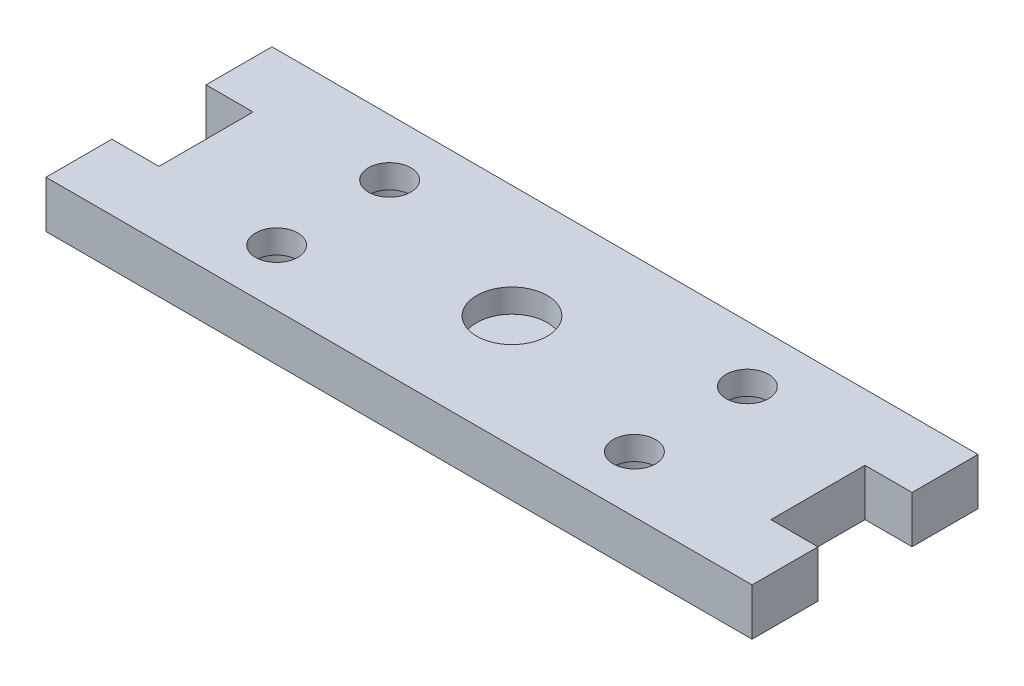
ISO-10303-21;
HEADER;
FILE_DESCRIPTION(('STEP AP214'),'2;1');
FILE_NAME('part.step','',(''),(''),'','','');
FILE_SCHEMA(('AUTOMOTIVE_DESIGN { 1 0 10303 214 1 1 1 1 }'));
ENDSEC;
DATA;
#1=APPLICATION_CONTEXT('core data for automotive mechanical design processes');
#2=APPLICATION_PROTOCOL_DEFINITION('international standard','automotive_design',2000,#1);
#3=PRODUCT_CONTEXT('',#1,'mechanical');
#4=PRODUCT('Part','Part','',(#3));
#5=PRODUCT_RELATED_PRODUCT_CATEGORY('part','',(#4));
#6=PRODUCT_DEFINITION_FORMATION('','',#4);
#7=PRODUCT_DEFINITION_CONTEXT('part definition',#1,'design');
#8=PRODUCT_DEFINITION('design','',#6,#7);
#9=PRODUCT_DEFINITION_SHAPE('','',#8);
#10=(LENGTH_UNIT() NAMED_UNIT(*) SI_UNIT(.MILLI.,.METRE.));
#11=(NAMED_UNIT(*) PLANE_ANGLE_UNIT() SI_UNIT($,.RADIAN.));
#12=(NAMED_UNIT(*) SI_UNIT($,.STERADIAN.) SOLID_ANGLE_UNIT());
#13=UNCERTAINTY_MEASURE_WITH_UNIT(LENGTH_MEASURE(1.E-05),#10,'distance_accuracy_value','');
#14=(GEOMETRIC_REPRESENTATION_CONTEXT(3) GLOBAL_UNCERTAINTY_ASSIGNED_CONTEXT((#13)) GLOBAL_UNIT_ASSIGNED_CONTEXT((#10,
#11,#12)) REPRESENTATION_CONTEXT('',''));
#15=CARTESIAN_POINT('',(0.,0.,0.));
#16=DIRECTION('',(0.,0.,1.));
#17=DIRECTION('',(1.,0.,0.));
#18=AXIS2_PLACEMENT_3D('',#15,#16,#17);
#19=CARTESIAN_POINT('',(75.,10.,-24.));
#20=DIRECTION('',(-1.,0.,0.));
#21=DIRECTION('',(0.,0.,1.));
#22=AXIS2_PLACEMENT_3D('',#19,#20,#21);
#23=PLANE('',#22);
#24=DIRECTION('',(0.,0.,-1.));
#25=VECTOR('',#24,1.);
#26=CARTESIAN_POINT('',(75.,0.,-24.));
#27=LINE('',#26,#25);
#28=CARTESIAN_POINT('',(75.,0.,24.));
#29=VERTEX_POINT('',#28);
#30=CARTESIAN_POINT('',(75.,0.,10.));
#31=VERTEX_POINT('',#30);
#32=EDGE_CURVE('E255',#29,#31,#27,.T.);
#33=ORIENTED_EDGE('',*,*,#32,.T.);
#34=DIRECTION('',(0.,1.,0.));
#35=VECTOR('',#34,1.);
#36=CARTESIAN_POINT('',(75.,10.,10.));
#37=LINE('',#36,#35);
#38=CARTESIAN_POINT('',(75.,10.,10.));
#39=VERTEX_POINT('',#38);
#40=EDGE_CURVE('E135',#31,#39,#37,.T.);
#41=ORIENTED_EDGE('',*,*,#40,.T.);
#42=DIRECTION('',(0.,0.,-1.));
#43=VECTOR('',#42,1.);
#44=CARTESIAN_POINT('',(75.,10.,-24.));
#45=LINE('',#44,#43);
#46=CARTESIAN_POINT('',(75.,10.,24.));
#47=VERTEX_POINT('',#46);
#48=EDGE_CURVE('E242',#47,#39,#45,.T.);
#49=ORIENTED_EDGE('',*,*,#48,.F.);
#50=DIRECTION('',(0.,-1.,0.));
#51=VECTOR('',#50,1.);
#52=CARTESIAN_POINT('',(75.,10.,24.));
#53=LINE('',#52,#51);
#54=EDGE_CURVE('E254',#47,#29,#53,.T.);
#55=ORIENTED_EDGE('',*,*,#54,.T.);
#56=EDGE_LOOP('',(#33,#41,#49,#55));
#57=FACE_BOUND('',#56,.T.);
#58=ADVANCED_FACE('F33',(#57),#23,.F.);
#59=CARTESIAN_POINT('',(-75.,10.,-24.));
#60=DIRECTION('',(1.,0.,0.));
#61=DIRECTION('',(0.,0.,-1.));
#62=AXIS2_PLACEMENT_3D('',#59,#60,#61);
#63=PLANE('',#62);
#64=DIRECTION('',(0.,0.,1.));
#65=VECTOR('',#64,1.);
#66=CARTESIAN_POINT('',(-75.,10.,-24.));
#67=LINE('',#66,#65);
#68=CARTESIAN_POINT('',(-75.,10.,10.));
#69=VERTEX_POINT('',#68);
#70=CARTESIAN_POINT('',(-75.,10.,24.));
#71=VERTEX_POINT('',#70);
#72=EDGE_CURVE('E248',#69,#71,#67,.T.);
#73=ORIENTED_EDGE('',*,*,#72,.F.);
#74=DIRECTION('',(0.,-1.,0.));
#75=VECTOR('',#74,1.);
#76=CARTESIAN_POINT('',(-75.,10.,10.));
#77=LINE('',#76,#75);
#78=CARTESIAN_POINT('',(-75.,0.,10.));
#79=VERTEX_POINT('',#78);
#80=EDGE_CURVE('E168',#69,#79,#77,.T.);
#81=ORIENTED_EDGE('',*,*,#80,.T.);
#82=DIRECTION('',(0.,0.,1.));
#83=VECTOR('',#82,1.);
#84=CARTESIAN_POINT('',(-75.,0.,-24.));
#85=LINE('',#84,#83);
#86=CARTESIAN_POINT('',(-75.,0.,24.));
#87=VERTEX_POINT('',#86);
#88=EDGE_CURVE('E259',#79,#87,#85,.T.);
#89=ORIENTED_EDGE('',*,*,#88,.T.);
#90=DIRECTION('',(0.,-1.,0.));
#91=VECTOR('',#90,1.);
#92=CARTESIAN_POINT('',(-75.,10.,24.));
#93=LINE('',#92,#91);
#94=EDGE_CURVE('E267',#71,#87,#93,.T.);
#95=ORIENTED_EDGE('',*,*,#94,.F.);
#96=EDGE_LOOP('',(#73,#81,#89,#95));
#97=FACE_BOUND('',#96,.T.);
#98=ADVANCED_FACE('F284',(#97),#63,.F.);
#99=CARTESIAN_POINT('',(75.,10.,-10.));
#100=VERTEX_POINT('',#99);
#101=CARTESIAN_POINT('',(75.,10.,-24.));
#102=VERTEX_POINT('',#101);
#103=EDGE_CURVE('E246',#100,#102,#45,.T.);
#104=ORIENTED_EDGE('',*,*,#103,.F.);
#105=DIRECTION('',(0.,-1.,0.));
#106=VECTOR('',#105,1.);
#107=CARTESIAN_POINT('',(75.,10.,-10.));
#108=LINE('',#107,#106);
#109=CARTESIAN_POINT('',(75.,0.,-10.));
#110=VERTEX_POINT('',#109);
#111=EDGE_CURVE('E171',#100,#110,#108,.T.);
#112=ORIENTED_EDGE('',*,*,#111,.T.);
#113=CARTESIAN_POINT('',(75.,0.,-24.));
#114=VERTEX_POINT('',#113);
#115=EDGE_CURVE('E241',#110,#114,#27,.T.);
#116=ORIENTED_EDGE('',*,*,#115,.T.);
#117=DIRECTION('',(0.,-1.,0.));
#118=VECTOR('',#117,1.);
#119=CARTESIAN_POINT('',(75.,10.,-24.));
#120=LINE('',#119,#118);
#121=EDGE_CURVE('E273',#102,#114,#120,.T.);
#122=ORIENTED_EDGE('',*,*,#121,.F.);
#123=EDGE_LOOP('',(#104,#112,#116,#122));
#124=FACE_BOUND('',#123,.T.);
#125=ADVANCED_FACE('F35',(#124),#23,.F.);
#126=CARTESIAN_POINT('',(-75.,10.,-24.));
#127=DIRECTION('',(0.,0.,1.));
#128=DIRECTION('',(1.,0.,0.));
#129=AXIS2_PLACEMENT_3D('',#126,#127,#128);
#130=PLANE('',#129);
#131=DIRECTION('',(-1.,0.,0.));
#132=VECTOR('',#131,1.);
#133=CARTESIAN_POINT('',(-75.,0.,-24.));
#134=LINE('',#133,#132);
#135=CARTESIAN_POINT('',(-75.,0.,-24.));
#136=VERTEX_POINT('',#135);
#137=EDGE_CURVE('E257',#114,#136,#134,.T.);
#138=ORIENTED_EDGE('',*,*,#137,.T.);
#139=DIRECTION('',(0.,-1.,0.));
#140=VECTOR('',#139,1.);
#141=CARTESIAN_POINT('',(-75.,10.,-24.));
#142=LINE('',#141,#140);
#143=CARTESIAN_POINT('',(-75.,10.,-24.));
#144=VERTEX_POINT('',#143);
#145=EDGE_CURVE('E270',#144,#136,#142,.T.);
#146=ORIENTED_EDGE('',*,*,#145,.F.);
#147=DIRECTION('',(-1.,0.,0.));
#148=VECTOR('',#147,1.);
#149=CARTESIAN_POINT('',(-75.,10.,-24.));
#150=LINE('',#149,#148);
#151=EDGE_CURVE('E245',#102,#144,#150,.T.);
#152=ORIENTED_EDGE('',*,*,#151,.F.);
#153=ORIENTED_EDGE('',*,*,#121,.T.);
#154=EDGE_LOOP('',(#138,#146,#152,#153));
#155=FACE_BOUND('',#154,.T.);
#156=ADVANCED_FACE('F304',(#155),#130,.F.);
#157=CARTESIAN_POINT('',(-75.,0.,-9.99999999999996));
#158=VERTEX_POINT('',#157);
#159=EDGE_CURVE('E260',#136,#158,#85,.T.);
#160=ORIENTED_EDGE('',*,*,#159,.T.);
#161=DIRECTION('',(0.,1.,0.));
#162=VECTOR('',#161,1.);
#163=CARTESIAN_POINT('',(-75.,10.,-9.99999999999995));
#164=LINE('',#163,#162);
#165=CARTESIAN_POINT('',(-75.,10.,-9.99999999999995));
#166=VERTEX_POINT('',#165);
#167=EDGE_CURVE('E56',#158,#166,#164,.T.);
#168=ORIENTED_EDGE('',*,*,#167,.T.);
#169=EDGE_CURVE('E249',#144,#166,#67,.T.);
#170=ORIENTED_EDGE('',*,*,#169,.F.);
#171=ORIENTED_EDGE('',*,*,#145,.T.);
#172=EDGE_LOOP('',(#160,#168,#170,#171));
#173=FACE_BOUND('',#172,.T.);
#174=ADVANCED_FACE('F299',(#173),#63,.F.);
#175=CARTESIAN_POINT('',(-75.,10.,24.));
#176=DIRECTION('',(0.,0.,-1.));
#177=DIRECTION('',(-1.,0.,0.));
#178=AXIS2_PLACEMENT_3D('',#175,#176,#177);
#179=PLANE('',#178);
#180=DIRECTION('',(1.,0.,0.));
#181=VECTOR('',#180,1.);
#182=CARTESIAN_POINT('',(-75.,0.,24.));
#183=LINE('',#182,#181);
#184=EDGE_CURVE('E263',#87,#29,#183,.T.);
#185=ORIENTED_EDGE('',*,*,#184,.T.);
#186=ORIENTED_EDGE('',*,*,#54,.F.);
#187=DIRECTION('',(1.,0.,0.));
#188=VECTOR('',#187,1.);
#189=CARTESIAN_POINT('',(-75.,10.,24.));
#190=LINE('',#189,#188);
#191=EDGE_CURVE('E252',#71,#47,#190,.T.);
#192=ORIENTED_EDGE('',*,*,#191,.F.);
#193=ORIENTED_EDGE('',*,*,#94,.T.);
#194=EDGE_LOOP('',(#185,#186,#192,#193));
#195=FACE_BOUND('',#194,.T.);
#196=ADVANCED_FACE('F314',(#195),#179,.F.);
#197=CARTESIAN_POINT('',(0.,10.,0.));
#198=DIRECTION('',(0.,1.,0.));
#199=DIRECTION('',(0.,0.,1.));
#200=AXIS2_PLACEMENT_3D('',#197,#198,#199);
#201=PLANE('',#200);
#202=DIRECTION('',(1.,0.,0.));
#203=VECTOR('',#202,1.);
#204=CARTESIAN_POINT('',(65.,10.,10.));
#205=LINE('',#204,#203);
#206=CARTESIAN_POINT('',(65.,10.,10.));
#207=VERTEX_POINT('',#206);
#208=EDGE_CURVE('E142',#207,#39,#205,.T.);
#209=ORIENTED_EDGE('',*,*,#208,.F.);
#210=DIRECTION('',(0.,0.,1.));
#211=VECTOR('',#210,1.);
#212=CARTESIAN_POINT('',(65.,10.,10.));
#213=LINE('',#212,#211);
#214=CARTESIAN_POINT('',(65.,10.,-10.));
#215=VERTEX_POINT('',#214);
#216=EDGE_CURVE('E126',#215,#207,#213,.T.);
#217=ORIENTED_EDGE('',*,*,#216,.F.);
#218=DIRECTION('',(-1.,0.,0.));
#219=VECTOR('',#218,1.);
#220=CARTESIAN_POINT('',(65.,10.,-10.));
#221=LINE('',#220,#219);
#222=EDGE_CURVE('E146',#100,#215,#221,.T.);
#223=ORIENTED_EDGE('',*,*,#222,.F.);
#224=ORIENTED_EDGE('',*,*,#103,.T.);
#225=ORIENTED_EDGE('',*,*,#151,.T.);
#226=ORIENTED_EDGE('',*,*,#169,.T.);
#227=DIRECTION('',(-1.,0.,0.));
#228=VECTOR('',#227,1.);
#229=CARTESIAN_POINT('',(-65.,10.,-9.99999999999996));
#230=LINE('',#229,#228);
#231=CARTESIAN_POINT('',(-65.,10.,-9.99999999999996));
#232=VERTEX_POINT('',#231);
#233=EDGE_CURVE('E161',#232,#166,#230,.T.);
#234=ORIENTED_EDGE('',*,*,#233,.F.);
#235=DIRECTION('',(0.,0.,-1.));
#236=VECTOR('',#235,1.);
#237=CARTESIAN_POINT('',(-64.9999999999999,10.,10.));
#238=LINE('',#237,#236);
#239=CARTESIAN_POINT('',(-64.9999999999999,10.,10.));
#240=VERTEX_POINT('',#239);
#241=EDGE_CURVE('E158',#240,#232,#238,.T.);
#242=ORIENTED_EDGE('',*,*,#241,.F.);
#243=DIRECTION('',(1.,0.,0.));
#244=VECTOR('',#243,1.);
#245=CARTESIAN_POINT('',(-64.9999999999999,10.,10.));
#246=LINE('',#245,#244);
#247=EDGE_CURVE('E155',#69,#240,#246,.T.);
#248=ORIENTED_EDGE('',*,*,#247,.F.);
#249=ORIENTED_EDGE('',*,*,#72,.T.);
#250=ORIENTED_EDGE('',*,*,#191,.T.);
#251=ORIENTED_EDGE('',*,*,#48,.T.);
#252=EDGE_LOOP('',(#209,#217,#223,#224,#225,#226,#234,#242,#248,#249,#250,#251));
#253=FACE_BOUND('',#252,.T.);
#254=CARTESIAN_POINT('',(0.,10.,0.));
#255=DIRECTION('',(0.,1.,0.));
#256=DIRECTION('',(0.,0.,1.));
#257=AXIS2_PLACEMENT_3D('',#254,#255,#256);
#258=CIRCLE('',#257,7.5);
#259=CARTESIAN_POINT('',(0.,10.,7.5));
#260=VERTEX_POINT('',#259);
#261=EDGE_CURVE('E175',#260,#260,#258,.T.);
#262=ORIENTED_EDGE('',*,*,#261,.F.);
#263=EDGE_LOOP('',(#262));
#264=FACE_BOUND('',#263,.T.);
#265=CARTESIAN_POINT('',(38.,10.,12.));
#266=DIRECTION('',(0.,-1.,0.));
#267=DIRECTION('',(0.,0.,-1.));
#268=AXIS2_PLACEMENT_3D('',#265,#266,#267);
#269=CIRCLE('',#268,4.5);
#270=CARTESIAN_POINT('',(38.,10.,7.50000000000001));
#271=VERTEX_POINT('',#270);
#272=EDGE_CURVE('E193',#271,#271,#269,.T.);
#273=ORIENTED_EDGE('',*,*,#272,.T.);
#274=EDGE_LOOP('',(#273));
#275=FACE_BOUND('',#274,.T.);
#276=CARTESIAN_POINT('',(-38.,10.,12.));
#277=DIRECTION('',(0.,-1.,0.));
#278=DIRECTION('',(0.,0.,-1.));
#279=AXIS2_PLACEMENT_3D('',#276,#277,#278);
#280=CIRCLE('',#279,4.5);
#281=CARTESIAN_POINT('',(-38.,10.,7.50000000000001));
#282=VERTEX_POINT('',#281);
#283=EDGE_CURVE('E208',#282,#282,#280,.T.);
#284=ORIENTED_EDGE('',*,*,#283,.T.);
#285=EDGE_LOOP('',(#284));
#286=FACE_BOUND('',#285,.T.);
#287=CARTESIAN_POINT('',(38.,10.,-12.));
#288=DIRECTION('',(0.,-1.,0.));
#289=DIRECTION('',(0.,0.,-1.));
#290=AXIS2_PLACEMENT_3D('',#287,#288,#289);
#291=CIRCLE('',#290,4.5);
#292=CARTESIAN_POINT('',(38.,10.,-16.5));
#293=VERTEX_POINT('',#292);
#294=EDGE_CURVE('E223',#293,#293,#291,.T.);
#295=ORIENTED_EDGE('',*,*,#294,.T.);
#296=EDGE_LOOP('',(#295));
#297=FACE_BOUND('',#296,.T.);
#298=CARTESIAN_POINT('',(-38.,10.,-12.));
#299=DIRECTION('',(0.,-1.,0.));
#300=DIRECTION('',(0.,0.,-1.));
#301=AXIS2_PLACEMENT_3D('',#298,#299,#300);
#302=CIRCLE('',#301,4.5);
#303=CARTESIAN_POINT('',(-38.,10.,-16.5));
#304=VERTEX_POINT('',#303);
#305=EDGE_CURVE('E238',#304,#304,#302,.T.);
#306=ORIENTED_EDGE('',*,*,#305,.T.);
#307=EDGE_LOOP('',(#306));
#308=FACE_BOUND('',#307,.T.);
#309=ADVANCED_FACE('F288',(#253,#264,#275,#286,#297,#308),#201,.T.);
#310=CARTESIAN_POINT('',(0.,0.,0.));
#311=DIRECTION('',(0.,1.,0.));
#312=DIRECTION('',(0.,0.,1.));
#313=AXIS2_PLACEMENT_3D('',#310,#311,#312);
#314=PLANE('',#313);
#315=CARTESIAN_POINT('',(38.,0.,12.));
#316=DIRECTION('',(0.,-1.,0.));
#317=DIRECTION('',(0.,0.,-1.));
#318=AXIS2_PLACEMENT_3D('',#315,#316,#317);
#319=CIRCLE('',#318,7.525);
#320=CARTESIAN_POINT('',(38.,0.,4.47500000000001));
#321=VERTEX_POINT('',#320);
#322=EDGE_CURVE('E179',#321,#321,#319,.T.);
#323=ORIENTED_EDGE('',*,*,#322,.F.);
#324=EDGE_LOOP('',(#323));
#325=FACE_BOUND('',#324,.T.);
#326=CARTESIAN_POINT('',(-38.,0.,12.));
#327=DIRECTION('',(0.,-1.,0.));
#328=DIRECTION('',(0.,0.,-1.));
#329=AXIS2_PLACEMENT_3D('',#326,#327,#328);
#330=CIRCLE('',#329,7.525);
#331=CARTESIAN_POINT('',(-38.,0.,4.47500000000001));
#332=VERTEX_POINT('',#331);
#333=EDGE_CURVE('E196',#332,#332,#330,.T.);
#334=ORIENTED_EDGE('',*,*,#333,.F.);
#335=EDGE_LOOP('',(#334));
#336=FACE_BOUND('',#335,.T.);
#337=CARTESIAN_POINT('',(38.,0.,-12.));
#338=DIRECTION('',(0.,-1.,0.));
#339=DIRECTION('',(0.,0.,-1.));
#340=AXIS2_PLACEMENT_3D('',#337,#338,#339);
#341=CIRCLE('',#340,7.525);
#342=CARTESIAN_POINT('',(38.,0.,-19.525));
#343=VERTEX_POINT('',#342);
#344=EDGE_CURVE('E211',#343,#343,#341,.T.);
#345=ORIENTED_EDGE('',*,*,#344,.F.);
#346=EDGE_LOOP('',(#345));
#347=FACE_BOUND('',#346,.T.);
#348=CARTESIAN_POINT('',(-38.,0.,-12.));
#349=DIRECTION('',(0.,-1.,0.));
#350=DIRECTION('',(0.,0.,-1.));
#351=AXIS2_PLACEMENT_3D('',#348,#349,#350);
#352=CIRCLE('',#351,7.525);
#353=CARTESIAN_POINT('',(-38.,0.,-19.525));
#354=VERTEX_POINT('',#353);
#355=EDGE_CURVE('E226',#354,#354,#352,.T.);
#356=ORIENTED_EDGE('',*,*,#355,.F.);
#357=EDGE_LOOP('',(#356));
#358=FACE_BOUND('',#357,.T.);
#359=DIRECTION('',(0.,0.,1.));
#360=VECTOR('',#359,1.);
#361=CARTESIAN_POINT('',(65.,0.,10.));
#362=LINE('',#361,#360);
#363=CARTESIAN_POINT('',(65.,0.,-10.));
#364=VERTEX_POINT('',#363);
#365=CARTESIAN_POINT('',(65.,0.,10.));
#366=VERTEX_POINT('',#365);
#367=EDGE_CURVE('E48',#364,#366,#362,.T.);
#368=ORIENTED_EDGE('',*,*,#367,.T.);
#369=DIRECTION('',(1.,0.,0.));
#370=VECTOR('',#369,1.);
#371=CARTESIAN_POINT('',(65.,0.,10.));
#372=LINE('',#371,#370);
#373=EDGE_CURVE('E132',#366,#31,#372,.T.);
#374=ORIENTED_EDGE('',*,*,#373,.T.);
#375=ORIENTED_EDGE('',*,*,#32,.F.);
#376=ORIENTED_EDGE('',*,*,#184,.F.);
#377=ORIENTED_EDGE('',*,*,#88,.F.);
#378=DIRECTION('',(1.,0.,0.));
#379=VECTOR('',#378,1.);
#380=CARTESIAN_POINT('',(0.,0.,10.));
#381=LINE('',#380,#379);
#382=CARTESIAN_POINT('',(-64.9999999999999,0.,10.));
#383=VERTEX_POINT('',#382);
#384=EDGE_CURVE('E41',#79,#383,#381,.T.);
#385=ORIENTED_EDGE('',*,*,#384,.T.);
#386=DIRECTION('',(0.,0.,-1.));
#387=VECTOR('',#386,1.);
#388=CARTESIAN_POINT('',(-64.9999999999999,0.,10.));
#389=LINE('',#388,#387);
#390=CARTESIAN_POINT('',(-65.,0.,-9.99999999999996));
#391=VERTEX_POINT('',#390);
#392=EDGE_CURVE('E151',#383,#391,#389,.T.);
#393=ORIENTED_EDGE('',*,*,#392,.T.);
#394=DIRECTION('',(-1.,0.,0.));
#395=VECTOR('',#394,1.);
#396=CARTESIAN_POINT('',(-65.,0.,-9.99999999999996));
#397=LINE('',#396,#395);
#398=EDGE_CURVE('E154',#391,#158,#397,.T.);
#399=ORIENTED_EDGE('',*,*,#398,.T.);
#400=ORIENTED_EDGE('',*,*,#159,.F.);
#401=ORIENTED_EDGE('',*,*,#137,.F.);
#402=ORIENTED_EDGE('',*,*,#115,.F.);
#403=DIRECTION('',(-1.,0.,0.));
#404=VECTOR('',#403,1.);
#405=CARTESIAN_POINT('',(0.,0.,-10.));
#406=LINE('',#405,#404);
#407=EDGE_CURVE('E11',#110,#364,#406,.T.);
#408=ORIENTED_EDGE('',*,*,#407,.T.);
#409=EDGE_LOOP('',(#368,#374,#375,#376,#377,#385,#393,#399,#400,#401,#402,#408));
#410=FACE_BOUND('',#409,.T.);
#411=ADVANCED_FACE('F140',(#325,#336,#347,#358,#410),#314,.F.);
#412=CARTESIAN_POINT('',(-38.,0.,-12.));
#413=DIRECTION('',(0.,-1.,0.));
#414=DIRECTION('',(0.,0.,-1.));
#415=AXIS2_PLACEMENT_3D('',#412,#413,#414);
#416=CYLINDRICAL_SURFACE('',#415,4.5);
#417=ORIENTED_EDGE('',*,*,#305,.F.);
#418=EDGE_LOOP('',(#417));
#419=FACE_BOUND('',#418,.T.);
#420=CARTESIAN_POINT('',(-38.,5.,-12.));
#421=DIRECTION('',(0.,-1.,0.));
#422=DIRECTION('',(0.,0.,-1.));
#423=AXIS2_PLACEMENT_3D('',#420,#421,#422);
#424=CIRCLE('',#423,4.5);
#425=CARTESIAN_POINT('',(-38.,5.,-16.5));
#426=VERTEX_POINT('',#425);
#427=EDGE_CURVE('E235',#426,#426,#424,.T.);
#428=ORIENTED_EDGE('',*,*,#427,.T.);
#429=EDGE_LOOP('',(#428));
#430=FACE_BOUND('',#429,.T.);
#431=ADVANCED_FACE('F354',(#419,#430),#416,.F.);
#432=CARTESIAN_POINT('',(-33.5,5.,-12.));
#433=DIRECTION('',(0.,1.,0.));
#434=DIRECTION('',(0.,0.,1.));
#435=AXIS2_PLACEMENT_3D('',#432,#433,#434);
#436=PLANE('',#435);
#437=ORIENTED_EDGE('',*,*,#427,.F.);
#438=EDGE_LOOP('',(#437));
#439=FACE_BOUND('',#438,.T.);
#440=CARTESIAN_POINT('',(-38.,5.,-12.));
#441=DIRECTION('',(0.,-1.,0.));
#442=DIRECTION('',(0.,0.,-1.));
#443=AXIS2_PLACEMENT_3D('',#440,#441,#442);
#444=CIRCLE('',#443,7.5);
#445=CARTESIAN_POINT('',(-38.,5.,-19.5));
#446=VERTEX_POINT('',#445);
#447=EDGE_CURVE('E232',#446,#446,#444,.T.);
#448=ORIENTED_EDGE('',*,*,#447,.T.);
#449=EDGE_LOOP('',(#448));
#450=FACE_BOUND('',#449,.T.);
#451=ADVANCED_FACE('F471',(#439,#450),#436,.F.);
#452=CARTESIAN_POINT('',(-38.,0.,-12.));
#453=DIRECTION('',(0.,-1.,0.));
#454=DIRECTION('',(0.,0.,-1.));
#455=AXIS2_PLACEMENT_3D('',#452,#453,#454);
#456=CYLINDRICAL_SURFACE('',#455,7.5);
#457=ORIENTED_EDGE('',*,*,#447,.F.);
#458=EDGE_LOOP('',(#457));
#459=FACE_BOUND('',#458,.T.);
#460=CARTESIAN_POINT('',(-38.,0.0250000000000042,-12.));
#461=DIRECTION('',(0.,-1.,0.));
#462=DIRECTION('',(0.,0.,-1.));
#463=AXIS2_PLACEMENT_3D('',#460,#461,#462);
#464=CIRCLE('',#463,7.5);
#465=CARTESIAN_POINT('',(-38.,0.0250000000000042,-19.5));
#466=VERTEX_POINT('',#465);
#467=EDGE_CURVE('E229',#466,#466,#464,.T.);
#468=ORIENTED_EDGE('',*,*,#467,.T.);
#469=EDGE_LOOP('',(#468));
#470=FACE_BOUND('',#469,.T.);
#471=ADVANCED_FACE('F467',(#459,#470),#456,.F.);
#472=CARTESIAN_POINT('',(-38.,0.,-12.));
#473=DIRECTION('',(0.,-1.,0.));
#474=DIRECTION('',(0.,0.,-1.));
#475=AXIS2_PLACEMENT_3D('',#472,#473,#474);
#476=CONICAL_SURFACE('',#475,7.525,0.785398163397396);
#477=ORIENTED_EDGE('',*,*,#467,.F.);
#478=EDGE_LOOP('',(#477));
#479=FACE_BOUND('',#478,.T.);
#480=ORIENTED_EDGE('',*,*,#355,.T.);
#481=EDGE_LOOP('',(#480));
#482=FACE_BOUND('',#481,.T.);
#483=ADVANCED_FACE('F463',(#479,#482),#476,.F.);
#484=CARTESIAN_POINT('',(38.,0.,-12.));
#485=DIRECTION('',(0.,-1.,0.));
#486=DIRECTION('',(0.,0.,-1.));
#487=AXIS2_PLACEMENT_3D('',#484,#485,#486);
#488=CYLINDRICAL_SURFACE('',#487,4.5);
#489=ORIENTED_EDGE('',*,*,#294,.F.);
#490=EDGE_LOOP('',(#489));
#491=FACE_BOUND('',#490,.T.);
#492=CARTESIAN_POINT('',(38.,5.,-12.));
#493=DIRECTION('',(0.,-1.,0.));
#494=DIRECTION('',(0.,0.,-1.));
#495=AXIS2_PLACEMENT_3D('',#492,#493,#494);
#496=CIRCLE('',#495,4.5);
#497=CARTESIAN_POINT('',(38.,5.,-16.5));
#498=VERTEX_POINT('',#497);
#499=EDGE_CURVE('E220',#498,#498,#496,.T.);
#500=ORIENTED_EDGE('',*,*,#499,.T.);
#501=EDGE_LOOP('',(#500));
#502=FACE_BOUND('',#501,.T.);
#503=ADVANCED_FACE('F459',(#491,#502),#488,.F.);
#504=CARTESIAN_POINT('',(42.5,5.,-12.));
#505=DIRECTION('',(0.,1.,0.));
#506=DIRECTION('',(0.,0.,1.));
#507=AXIS2_PLACEMENT_3D('',#504,#505,#506);
#508=PLANE('',#507);
#509=ORIENTED_EDGE('',*,*,#499,.F.);
#510=EDGE_LOOP('',(#509));
#511=FACE_BOUND('',#510,.T.);
#512=CARTESIAN_POINT('',(38.,5.,-12.));
#513=DIRECTION('',(0.,-1.,0.));
#514=DIRECTION('',(0.,0.,-1.));
#515=AXIS2_PLACEMENT_3D('',#512,#513,#514);
#516=CIRCLE('',#515,7.5);
#517=CARTESIAN_POINT('',(38.,5.,-19.5));
#518=VERTEX_POINT('',#517);
#519=EDGE_CURVE('E217',#518,#518,#516,.T.);
#520=ORIENTED_EDGE('',*,*,#519,.T.);
#521=EDGE_LOOP('',(#520));
#522=FACE_BOUND('',#521,.T.);
#523=ADVANCED_FACE('F455',(#511,#522),#508,.F.);
#524=CARTESIAN_POINT('',(38.,0.,-12.));
#525=DIRECTION('',(0.,-1.,0.));
#526=DIRECTION('',(0.,0.,-1.));
#527=AXIS2_PLACEMENT_3D('',#524,#525,#526);
#528=CYLINDRICAL_SURFACE('',#527,7.5);
#529=ORIENTED_EDGE('',*,*,#519,.F.);
#530=EDGE_LOOP('',(#529));
#531=FACE_BOUND('',#530,.T.);
#532=CARTESIAN_POINT('',(38.,0.0250000000000042,-12.));
#533=DIRECTION('',(0.,-1.,0.));
#534=DIRECTION('',(0.,0.,-1.));
#535=AXIS2_PLACEMENT_3D('',#532,#533,#534);
#536=CIRCLE('',#535,7.5);
#537=CARTESIAN_POINT('',(38.,0.0250000000000042,-19.5));
#538=VERTEX_POINT('',#537);
#539=EDGE_CURVE('E214',#538,#538,#536,.T.);
#540=ORIENTED_EDGE('',*,*,#539,.T.);
#541=EDGE_LOOP('',(#540));
#542=FACE_BOUND('',#541,.T.);
#543=ADVANCED_FACE('F451',(#531,#542),#528,.F.);
#544=CARTESIAN_POINT('',(38.,0.,-12.));
#545=DIRECTION('',(0.,-1.,0.));
#546=DIRECTION('',(0.,0.,-1.));
#547=AXIS2_PLACEMENT_3D('',#544,#545,#546);
#548=CONICAL_SURFACE('',#547,7.525,0.785398163397327);
#549=ORIENTED_EDGE('',*,*,#539,.F.);
#550=EDGE_LOOP('',(#549));
#551=FACE_BOUND('',#550,.T.);
#552=ORIENTED_EDGE('',*,*,#344,.T.);
#553=EDGE_LOOP('',(#552));
#554=FACE_BOUND('',#553,.T.);
#555=ADVANCED_FACE('F447',(#551,#554),#548,.F.);
#556=CARTESIAN_POINT('',(-38.,0.,12.));
#557=DIRECTION('',(0.,-1.,0.));
#558=DIRECTION('',(0.,0.,-1.));
#559=AXIS2_PLACEMENT_3D('',#556,#557,#558);
#560=CYLINDRICAL_SURFACE('',#559,4.5);
#561=ORIENTED_EDGE('',*,*,#283,.F.);
#562=EDGE_LOOP('',(#561));
#563=FACE_BOUND('',#562,.T.);
#564=CARTESIAN_POINT('',(-38.,5.,12.));
#565=DIRECTION('',(0.,-1.,0.));
#566=DIRECTION('',(0.,0.,-1.));
#567=AXIS2_PLACEMENT_3D('',#564,#565,#566);
#568=CIRCLE('',#567,4.5);
#569=CARTESIAN_POINT('',(-38.,5.,7.50000000000001));
#570=VERTEX_POINT('',#569);
#571=EDGE_CURVE('E205',#570,#570,#568,.T.);
#572=ORIENTED_EDGE('',*,*,#571,.T.);
#573=EDGE_LOOP('',(#572));
#574=FACE_BOUND('',#573,.T.);
#575=ADVANCED_FACE('F443',(#563,#574),#560,.F.);
#576=CARTESIAN_POINT('',(-33.5,5.,12.));
#577=DIRECTION('',(0.,1.,0.));
#578=DIRECTION('',(0.,0.,1.));
#579=AXIS2_PLACEMENT_3D('',#576,#577,#578);
#580=PLANE('',#579);
#581=ORIENTED_EDGE('',*,*,#571,.F.);
#582=EDGE_LOOP('',(#581));
#583=FACE_BOUND('',#582,.T.);
#584=CARTESIAN_POINT('',(-38.,5.,12.));
#585=DIRECTION('',(0.,-1.,0.));
#586=DIRECTION('',(0.,0.,-1.));
#587=AXIS2_PLACEMENT_3D('',#584,#585,#586);
#588=CIRCLE('',#587,7.5);
#589=CARTESIAN_POINT('',(-38.,5.,4.50000000000001));
#590=VERTEX_POINT('',#589);
#591=EDGE_CURVE('E202',#590,#590,#588,.T.);
#592=ORIENTED_EDGE('',*,*,#591,.T.);
#593=EDGE_LOOP('',(#592));
#594=FACE_BOUND('',#593,.T.);
#595=ADVANCED_FACE('F439',(#583,#594),#580,.F.);
#596=CARTESIAN_POINT('',(-38.,0.,12.));
#597=DIRECTION('',(0.,-1.,0.));
#598=DIRECTION('',(0.,0.,-1.));
#599=AXIS2_PLACEMENT_3D('',#596,#597,#598);
#600=CYLINDRICAL_SURFACE('',#599,7.5);
#601=ORIENTED_EDGE('',*,*,#591,.F.);
#602=EDGE_LOOP('',(#601));
#603=FACE_BOUND('',#602,.T.);
#604=CARTESIAN_POINT('',(-38.,0.0250000000000042,12.));
#605=DIRECTION('',(0.,-1.,0.));
#606=DIRECTION('',(0.,0.,-1.));
#607=AXIS2_PLACEMENT_3D('',#604,#605,#606);
#608=CIRCLE('',#607,7.5);
#609=CARTESIAN_POINT('',(-38.,0.0250000000000042,4.50000000000001));
#610=VERTEX_POINT('',#609);
#611=EDGE_CURVE('E199',#610,#610,#608,.T.);
#612=ORIENTED_EDGE('',*,*,#611,.T.);
#613=EDGE_LOOP('',(#612));
#614=FACE_BOUND('',#613,.T.);
#615=ADVANCED_FACE('F435',(#603,#614),#600,.F.);
#616=CARTESIAN_POINT('',(-38.,0.,12.));
#617=DIRECTION('',(0.,-1.,0.));
#618=DIRECTION('',(0.,0.,-1.));
#619=AXIS2_PLACEMENT_3D('',#616,#617,#618);
#620=CONICAL_SURFACE('',#619,7.525,0.785398163397396);
#621=ORIENTED_EDGE('',*,*,#611,.F.);
#622=EDGE_LOOP('',(#621));
#623=FACE_BOUND('',#622,.T.);
#624=ORIENTED_EDGE('',*,*,#333,.T.);
#625=EDGE_LOOP('',(#624));
#626=FACE_BOUND('',#625,.T.);
#627=ADVANCED_FACE('F431',(#623,#626),#620,.F.);
#628=CARTESIAN_POINT('',(38.,0.,12.));
#629=DIRECTION('',(0.,-1.,0.));
#630=DIRECTION('',(0.,0.,-1.));
#631=AXIS2_PLACEMENT_3D('',#628,#629,#630);
#632=CYLINDRICAL_SURFACE('',#631,4.5);
#633=ORIENTED_EDGE('',*,*,#272,.F.);
#634=EDGE_LOOP('',(#633));
#635=FACE_BOUND('',#634,.T.);
#636=CARTESIAN_POINT('',(38.,5.,12.));
#637=DIRECTION('',(0.,-1.,0.));
#638=DIRECTION('',(0.,0.,-1.));
#639=AXIS2_PLACEMENT_3D('',#636,#637,#638);
#640=CIRCLE('',#639,4.5);
#641=CARTESIAN_POINT('',(38.,5.,7.50000000000001));
#642=VERTEX_POINT('',#641);
#643=EDGE_CURVE('E190',#642,#642,#640,.T.);
#644=ORIENTED_EDGE('',*,*,#643,.T.);
#645=EDGE_LOOP('',(#644));
#646=FACE_BOUND('',#645,.T.);
#647=ADVANCED_FACE('F427',(#635,#646),#632,.F.);
#648=CARTESIAN_POINT('',(42.5,5.,12.));
#649=DIRECTION('',(0.,1.,0.));
#650=DIRECTION('',(0.,0.,1.));
#651=AXIS2_PLACEMENT_3D('',#648,#649,#650);
#652=PLANE('',#651);
#653=ORIENTED_EDGE('',*,*,#643,.F.);
#654=EDGE_LOOP('',(#653));
#655=FACE_BOUND('',#654,.T.);
#656=CARTESIAN_POINT('',(38.,5.,12.));
#657=DIRECTION('',(0.,-1.,0.));
#658=DIRECTION('',(0.,0.,-1.));
#659=AXIS2_PLACEMENT_3D('',#656,#657,#658);
#660=CIRCLE('',#659,7.5);
#661=CARTESIAN_POINT('',(38.,5.,4.50000000000001));
#662=VERTEX_POINT('',#661);
#663=EDGE_CURVE('E187',#662,#662,#660,.T.);
#664=ORIENTED_EDGE('',*,*,#663,.T.);
#665=EDGE_LOOP('',(#664));
#666=FACE_BOUND('',#665,.T.);
#667=ADVANCED_FACE('F423',(#655,#666),#652,.F.);
#668=CARTESIAN_POINT('',(38.,0.,12.));
#669=DIRECTION('',(0.,-1.,0.));
#670=DIRECTION('',(0.,0.,-1.));
#671=AXIS2_PLACEMENT_3D('',#668,#669,#670);
#672=CYLINDRICAL_SURFACE('',#671,7.5);
#673=ORIENTED_EDGE('',*,*,#663,.F.);
#674=EDGE_LOOP('',(#673));
#675=FACE_BOUND('',#674,.T.);
#676=CARTESIAN_POINT('',(38.,0.0250000000000042,12.));
#677=DIRECTION('',(0.,-1.,0.));
#678=DIRECTION('',(0.,0.,-1.));
#679=AXIS2_PLACEMENT_3D('',#676,#677,#678);
#680=CIRCLE('',#679,7.5);
#681=CARTESIAN_POINT('',(38.,0.0250000000000042,4.50000000000001));
#682=VERTEX_POINT('',#681);
#683=EDGE_CURVE('E184',#682,#682,#680,.T.);
#684=ORIENTED_EDGE('',*,*,#683,.T.);
#685=EDGE_LOOP('',(#684));
#686=FACE_BOUND('',#685,.T.);
#687=ADVANCED_FACE('F419',(#675,#686),#672,.F.);
#688=CARTESIAN_POINT('',(38.,0.,12.));
#689=DIRECTION('',(0.,-1.,0.));
#690=DIRECTION('',(0.,0.,-1.));
#691=AXIS2_PLACEMENT_3D('',#688,#689,#690);
#692=CONICAL_SURFACE('',#691,7.525,0.785398163397327);
#693=ORIENTED_EDGE('',*,*,#683,.F.);
#694=EDGE_LOOP('',(#693));
#695=FACE_BOUND('',#694,.T.);
#696=ORIENTED_EDGE('',*,*,#322,.T.);
#697=EDGE_LOOP('',(#696));
#698=FACE_BOUND('',#697,.T.);
#699=ADVANCED_FACE('F415',(#695,#698),#692,.F.);
#700=CARTESIAN_POINT('',(0.,5.,0.));
#701=DIRECTION('',(0.,1.,0.));
#702=DIRECTION('',(0.,0.,1.));
#703=AXIS2_PLACEMENT_3D('',#700,#701,#702);
#704=CYLINDRICAL_SURFACE('',#703,7.5);
#705=CARTESIAN_POINT('',(0.,5.,0.));
#706=DIRECTION('',(0.,1.,0.));
#707=DIRECTION('',(0.,0.,1.));
#708=AXIS2_PLACEMENT_3D('',#705,#706,#707);
#709=CIRCLE('',#708,7.5);
#710=CARTESIAN_POINT('',(0.,5.,7.5));
#711=VERTEX_POINT('',#710);
#712=EDGE_CURVE('E176',#711,#711,#709,.T.);
#713=ORIENTED_EDGE('',*,*,#712,.F.);
#714=EDGE_LOOP('',(#713));
#715=FACE_BOUND('',#714,.T.);
#716=ORIENTED_EDGE('',*,*,#261,.T.);
#717=EDGE_LOOP('',(#716));
#718=FACE_BOUND('',#717,.T.);
#719=ADVANCED_FACE('F411',(#715,#718),#704,.F.);
#720=CARTESIAN_POINT('',(0.,5.,0.));
#721=DIRECTION('',(0.,1.,0.));
#722=DIRECTION('',(0.,0.,1.));
#723=AXIS2_PLACEMENT_3D('',#720,#721,#722);
#724=PLANE('',#723);
#725=ORIENTED_EDGE('',*,*,#712,.T.);
#726=EDGE_LOOP('',(#725));
#727=FACE_BOUND('',#726,.T.);
#728=ADVANCED_FACE('F363',(#727),#724,.T.);
#729=CARTESIAN_POINT('',(-64.9999999999999,0.,10.));
#730=DIRECTION('',(0.,0.,1.));
#731=DIRECTION('',(1.,0.,0.));
#732=AXIS2_PLACEMENT_3D('',#729,#730,#731);
#733=PLANE('',#732);
#734=ORIENTED_EDGE('',*,*,#247,.T.);
#735=DIRECTION('',(0.,1.,0.));
#736=VECTOR('',#735,1.);
#737=CARTESIAN_POINT('',(-64.9999999999999,0.,10.));
#738=LINE('',#737,#736);
#739=EDGE_CURVE('E148',#383,#240,#738,.T.);
#740=ORIENTED_EDGE('',*,*,#739,.F.);
#741=ORIENTED_EDGE('',*,*,#384,.F.);
#742=ORIENTED_EDGE('',*,*,#80,.F.);
#743=EDGE_LOOP('',(#734,#740,#741,#742));
#744=FACE_BOUND('',#743,.T.);
#745=ADVANCED_FACE('F280',(#744),#733,.F.);
#746=CARTESIAN_POINT('',(-65.,0.,-9.99999999999996));
#747=DIRECTION('',(0.,0.,-1.));
#748=DIRECTION('',(-1.,0.,0.));
#749=AXIS2_PLACEMENT_3D('',#746,#747,#748);
#750=PLANE('',#749);
#751=ORIENTED_EDGE('',*,*,#398,.F.);
#752=DIRECTION('',(0.,1.,0.));
#753=VECTOR('',#752,1.);
#754=CARTESIAN_POINT('',(-65.,0.,-9.99999999999996));
#755=LINE('',#754,#753);
#756=EDGE_CURVE('E157',#391,#232,#755,.T.);
#757=ORIENTED_EDGE('',*,*,#756,.T.);
#758=ORIENTED_EDGE('',*,*,#233,.T.);
#759=ORIENTED_EDGE('',*,*,#167,.F.);
#760=EDGE_LOOP('',(#751,#757,#758,#759));
#761=FACE_BOUND('',#760,.T.);
#762=ADVANCED_FACE('F295',(#761),#750,.F.);
#763=CARTESIAN_POINT('',(-64.9999999999999,0.,10.));
#764=DIRECTION('',(1.,0.,0.));
#765=DIRECTION('',(0.,0.,-1.));
#766=AXIS2_PLACEMENT_3D('',#763,#764,#765);
#767=PLANE('',#766);
#768=ORIENTED_EDGE('',*,*,#241,.T.);
#769=ORIENTED_EDGE('',*,*,#756,.F.);
#770=ORIENTED_EDGE('',*,*,#392,.F.);
#771=ORIENTED_EDGE('',*,*,#739,.T.);
#772=EDGE_LOOP('',(#768,#769,#770,#771));
#773=FACE_BOUND('',#772,.T.);
#774=ADVANCED_FACE('F294',(#773),#767,.F.);
#775=CARTESIAN_POINT('',(65.,0.,10.));
#776=DIRECTION('',(0.,0.,1.));
#777=DIRECTION('',(1.,0.,0.));
#778=AXIS2_PLACEMENT_3D('',#775,#776,#777);
#779=PLANE('',#778);
#780=ORIENTED_EDGE('',*,*,#373,.F.);
#781=DIRECTION('',(0.,1.,0.));
#782=VECTOR('',#781,1.);
#783=CARTESIAN_POINT('',(65.,0.,10.));
#784=LINE('',#783,#782);
#785=EDGE_CURVE('E122',#366,#207,#784,.T.);
#786=ORIENTED_EDGE('',*,*,#785,.T.);
#787=ORIENTED_EDGE('',*,*,#208,.T.);
#788=ORIENTED_EDGE('',*,*,#40,.F.);
#789=EDGE_LOOP('',(#780,#786,#787,#788));
#790=FACE_BOUND('',#789,.T.);
#791=ADVANCED_FACE('F133',(#790),#779,.F.);
#792=CARTESIAN_POINT('',(65.,0.,-10.));
#793=DIRECTION('',(0.,0.,-1.));
#794=DIRECTION('',(-1.,0.,0.));
#795=AXIS2_PLACEMENT_3D('',#792,#793,#794);
#796=PLANE('',#795);
#797=ORIENTED_EDGE('',*,*,#222,.T.);
#798=DIRECTION('',(0.,1.,0.));
#799=VECTOR('',#798,1.);
#800=CARTESIAN_POINT('',(65.,0.,-10.));
#801=LINE('',#800,#799);
#802=EDGE_CURVE('E129',#364,#215,#801,.T.);
#803=ORIENTED_EDGE('',*,*,#802,.F.);
#804=ORIENTED_EDGE('',*,*,#407,.F.);
#805=ORIENTED_EDGE('',*,*,#111,.F.);
#806=EDGE_LOOP('',(#797,#803,#804,#805));
#807=FACE_BOUND('',#806,.T.);
#808=ADVANCED_FACE('F310',(#807),#796,.F.);
#809=CARTESIAN_POINT('',(65.,0.,10.));
#810=DIRECTION('',(-1.,0.,0.));
#811=DIRECTION('',(0.,0.,1.));
#812=AXIS2_PLACEMENT_3D('',#809,#810,#811);
#813=PLANE('',#812);
#814=ORIENTED_EDGE('',*,*,#216,.T.);
#815=ORIENTED_EDGE('',*,*,#785,.F.);
#816=ORIENTED_EDGE('',*,*,#367,.F.);
#817=ORIENTED_EDGE('',*,*,#802,.T.);
#818=EDGE_LOOP('',(#814,#815,#816,#817));
#819=FACE_BOUND('',#818,.T.);
#820=ADVANCED_FACE('F124',(#819),#813,.F.);
#821=CLOSED_SHELL('',(#58,#98,#125,#156,#174,#196,#309,#411,#431,#451,#471,#483,#503,#523,#543,
#555,#575,#595,#615,#627,#647,#667,#687,#699,#719,#728,#745,#762,#774,#791,#808,#820));
#822=MANIFOLD_SOLID_BREP('B2',#821);
#823=ADVANCED_BREP_SHAPE_REPRESENTATION('',(#18,#822),#14);
#824=SHAPE_DEFINITION_REPRESENTATION(#9,#823);
ENDSEC;
END-ISO-10303-21;
